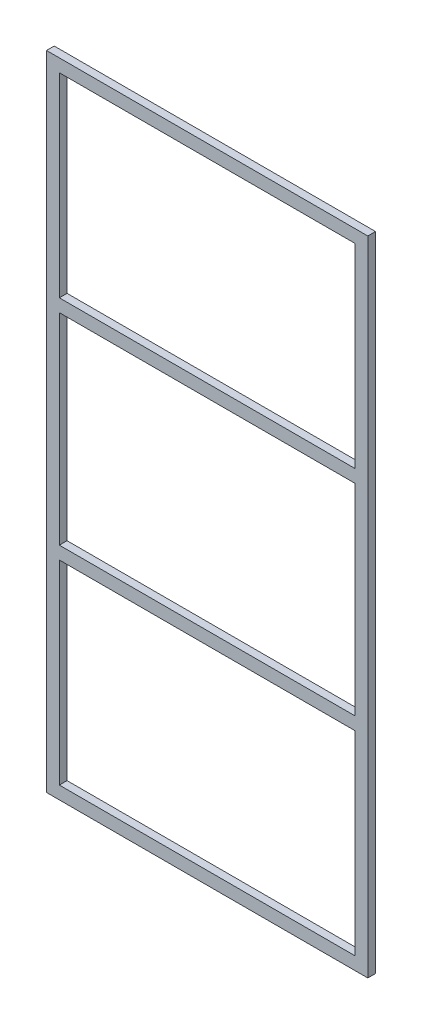
ISO-10303-21;
HEADER;
FILE_DESCRIPTION(('STEP AP214'),'2;1');
FILE_NAME('part.step','',(''),(''),'','','');
FILE_SCHEMA(('AUTOMOTIVE_DESIGN { 1 0 10303 214 1 1 1 1 }'));
ENDSEC;
DATA;
#1=APPLICATION_CONTEXT('core data for automotive mechanical design processes');
#2=APPLICATION_PROTOCOL_DEFINITION('international standard','automotive_design',2000,#1);
#3=PRODUCT_CONTEXT('',#1,'mechanical');
#4=PRODUCT('Part','Part','',(#3));
#5=PRODUCT_RELATED_PRODUCT_CATEGORY('part','',(#4));
#6=PRODUCT_DEFINITION_FORMATION('','',#4);
#7=PRODUCT_DEFINITION_CONTEXT('part definition',#1,'design');
#8=PRODUCT_DEFINITION('design','',#6,#7);
#9=PRODUCT_DEFINITION_SHAPE('','',#8);
#10=(LENGTH_UNIT() NAMED_UNIT(*) SI_UNIT(.MILLI.,.METRE.));
#11=(NAMED_UNIT(*) PLANE_ANGLE_UNIT() SI_UNIT($,.RADIAN.));
#12=(NAMED_UNIT(*) SI_UNIT($,.STERADIAN.) SOLID_ANGLE_UNIT());
#13=UNCERTAINTY_MEASURE_WITH_UNIT(LENGTH_MEASURE(1.E-05),#10,'distance_accuracy_value','');
#14=(GEOMETRIC_REPRESENTATION_CONTEXT(3) GLOBAL_UNCERTAINTY_ASSIGNED_CONTEXT((#13)) GLOBAL_UNIT_ASSIGNED_CONTEXT((#10,
#11,#12)) REPRESENTATION_CONTEXT('',''));
#15=CARTESIAN_POINT('',(0.,0.,0.));
#16=DIRECTION('',(0.,0.,1.));
#17=DIRECTION('',(1.,0.,0.));
#18=AXIS2_PLACEMENT_3D('',#15,#16,#17);
#19=CARTESIAN_POINT('',(0.,0.,6.));
#20=DIRECTION('',(0.,0.,1.));
#21=DIRECTION('',(1.,0.,0.));
#22=AXIS2_PLACEMENT_3D('',#19,#20,#21);
#23=PLANE('',#22);
#24=DIRECTION('',(0.,-1.,0.));
#25=VECTOR('',#24,1.);
#26=CARTESIAN_POINT('',(0.,0.,6.));
#27=LINE('',#26,#25);
#28=CARTESIAN_POINT('',(0.,0.,6.));
#29=VERTEX_POINT('',#28);
#30=CARTESIAN_POINT('',(0.,-500.,6.));
#31=VERTEX_POINT('',#30);
#32=EDGE_CURVE('E257',#29,#31,#27,.T.);
#33=ORIENTED_EDGE('',*,*,#32,.T.);
#34=DIRECTION('',(1.,0.,0.));
#35=VECTOR('',#34,1.);
#36=CARTESIAN_POINT('',(0.,-500.,6.));
#37=LINE('',#36,#35);
#38=CARTESIAN_POINT('',(250.,-500.,6.));
#39=VERTEX_POINT('',#38);
#40=EDGE_CURVE('E261',#31,#39,#37,.T.);
#41=ORIENTED_EDGE('',*,*,#40,.T.);
#42=DIRECTION('',(0.,1.,0.));
#43=VECTOR('',#42,1.);
#44=CARTESIAN_POINT('',(250.,0.,6.));
#45=LINE('',#44,#43);
#46=CARTESIAN_POINT('',(250.,0.,6.));
#47=VERTEX_POINT('',#46);
#48=EDGE_CURVE('E265',#39,#47,#45,.T.);
#49=ORIENTED_EDGE('',*,*,#48,.T.);
#50=DIRECTION('',(-1.,0.,0.));
#51=VECTOR('',#50,1.);
#52=CARTESIAN_POINT('',(0.,0.,6.));
#53=LINE('',#52,#51);
#54=EDGE_CURVE('E268',#47,#29,#53,.T.);
#55=ORIENTED_EDGE('',*,*,#54,.T.);
#56=EDGE_LOOP('',(#33,#41,#49,#55));
#57=FACE_BOUND('',#56,.T.);
#58=DIRECTION('',(1.,0.,0.));
#59=VECTOR('',#58,1.);
#60=CARTESIAN_POINT('',(0.,-171.666666,6.));
#61=LINE('',#60,#59);
#62=CARTESIAN_POINT('',(10.,-171.666666,6.));
#63=VERTEX_POINT('',#62);
#64=CARTESIAN_POINT('',(240.,-171.666666,6.));
#65=VERTEX_POINT('',#64);
#66=EDGE_CURVE('E231',#63,#65,#61,.T.);
#67=ORIENTED_EDGE('',*,*,#66,.T.);
#68=DIRECTION('',(0.,-1.,0.));
#69=VECTOR('',#68,1.);
#70=CARTESIAN_POINT('',(240.,0.,6.));
#71=LINE('',#70,#69);
#72=CARTESIAN_POINT('',(240.,-328.336666,6.));
#73=VERTEX_POINT('',#72);
#74=EDGE_CURVE('E197',#65,#73,#71,.T.);
#75=ORIENTED_EDGE('',*,*,#74,.T.);
#76=DIRECTION('',(1.,0.,0.));
#77=VECTOR('',#76,1.);
#78=CARTESIAN_POINT('',(0.,-328.336666,6.));
#79=LINE('',#78,#77);
#80=CARTESIAN_POINT('',(10.,-328.336666,6.));
#81=VERTEX_POINT('',#80);
#82=EDGE_CURVE('E239',#81,#73,#79,.T.);
#83=ORIENTED_EDGE('',*,*,#82,.F.);
#84=DIRECTION('',(0.,-1.,0.));
#85=VECTOR('',#84,1.);
#86=CARTESIAN_POINT('',(10.,0.,6.));
#87=LINE('',#86,#85);
#88=EDGE_CURVE('E235',#63,#81,#87,.T.);
#89=ORIENTED_EDGE('',*,*,#88,.F.);
#90=EDGE_LOOP('',(#67,#75,#83,#89));
#91=FACE_BOUND('',#90,.T.);
#92=DIRECTION('',(1.,0.,0.));
#93=VECTOR('',#92,1.);
#94=CARTESIAN_POINT('',(0.,-10.,6.));
#95=LINE('',#94,#93);
#96=CARTESIAN_POINT('',(10.,-10.,6.));
#97=VERTEX_POINT('',#96);
#98=CARTESIAN_POINT('',(240.,-10.,6.));
#99=VERTEX_POINT('',#98);
#100=EDGE_CURVE('E180',#97,#99,#95,.T.);
#101=ORIENTED_EDGE('',*,*,#100,.T.);
#102=DIRECTION('',(0.,-1.,0.));
#103=VECTOR('',#102,1.);
#104=CARTESIAN_POINT('',(240.,0.,6.));
#105=LINE('',#104,#103);
#106=CARTESIAN_POINT('',(240.,-161.666666,6.));
#107=VERTEX_POINT('',#106);
#108=EDGE_CURVE('E73',#99,#107,#105,.T.);
#109=ORIENTED_EDGE('',*,*,#108,.T.);
#110=DIRECTION('',(1.,0.,0.));
#111=VECTOR('',#110,1.);
#112=CARTESIAN_POINT('',(0.,-161.666666,6.));
#113=LINE('',#112,#111);
#114=CARTESIAN_POINT('',(10.,-161.666666,6.));
#115=VERTEX_POINT('',#114);
#116=EDGE_CURVE('E187',#115,#107,#113,.T.);
#117=ORIENTED_EDGE('',*,*,#116,.F.);
#118=DIRECTION('',(0.,-1.,0.));
#119=VECTOR('',#118,1.);
#120=CARTESIAN_POINT('',(10.,0.,6.));
#121=LINE('',#120,#119);
#122=EDGE_CURVE('E169',#97,#115,#121,.T.);
#123=ORIENTED_EDGE('',*,*,#122,.F.);
#124=EDGE_LOOP('',(#101,#109,#117,#123));
#125=FACE_BOUND('',#124,.T.);
#126=DIRECTION('',(1.,0.,0.));
#127=VECTOR('',#126,1.);
#128=CARTESIAN_POINT('',(0.,-338.336666,6.));
#129=LINE('',#128,#127);
#130=CARTESIAN_POINT('',(10.,-338.336666,6.));
#131=VERTEX_POINT('',#130);
#132=CARTESIAN_POINT('',(240.,-338.336666,6.));
#133=VERTEX_POINT('',#132);
#134=EDGE_CURVE('E204',#131,#133,#129,.T.);
#135=ORIENTED_EDGE('',*,*,#134,.T.);
#136=DIRECTION('',(0.,-1.,0.));
#137=VECTOR('',#136,1.);
#138=CARTESIAN_POINT('',(240.,0.,6.));
#139=LINE('',#138,#137);
#140=CARTESIAN_POINT('',(240.,-490.,6.));
#141=VERTEX_POINT('',#140);
#142=EDGE_CURVE('E65',#133,#141,#139,.T.);
#143=ORIENTED_EDGE('',*,*,#142,.T.);
#144=DIRECTION('',(1.,0.,0.));
#145=VECTOR('',#144,1.);
#146=CARTESIAN_POINT('',(0.,-490.,6.));
#147=LINE('',#146,#145);
#148=CARTESIAN_POINT('',(10.,-490.,6.));
#149=VERTEX_POINT('',#148);
#150=EDGE_CURVE('E212',#149,#141,#147,.T.);
#151=ORIENTED_EDGE('',*,*,#150,.F.);
#152=DIRECTION('',(0.,-1.,0.));
#153=VECTOR('',#152,1.);
#154=CARTESIAN_POINT('',(9.99999999999998,0.,6.));
#155=LINE('',#154,#153);
#156=EDGE_CURVE('E208',#131,#149,#155,.T.);
#157=ORIENTED_EDGE('',*,*,#156,.F.);
#158=EDGE_LOOP('',(#135,#143,#151,#157));
#159=FACE_BOUND('',#158,.T.);
#160=ADVANCED_FACE('F49',(#57,#91,#125,#159),#23,.T.);
#161=CARTESIAN_POINT('',(0.,0.,0.));
#162=DIRECTION('',(0.,0.,1.));
#163=DIRECTION('',(1.,0.,0.));
#164=AXIS2_PLACEMENT_3D('',#161,#162,#163);
#165=PLANE('',#164);
#166=DIRECTION('',(0.,-1.,0.));
#167=VECTOR('',#166,1.);
#168=CARTESIAN_POINT('',(240.,0.,0.));
#169=LINE('',#168,#167);
#170=CARTESIAN_POINT('',(240.,-10.,0.));
#171=VERTEX_POINT('',#170);
#172=CARTESIAN_POINT('',(240.,-161.666666,0.));
#173=VERTEX_POINT('',#172);
#174=EDGE_CURVE('E321',#171,#173,#169,.T.);
#175=ORIENTED_EDGE('',*,*,#174,.F.);
#176=DIRECTION('',(1.,0.,0.));
#177=VECTOR('',#176,1.);
#178=CARTESIAN_POINT('',(0.,-10.,0.));
#179=LINE('',#178,#177);
#180=CARTESIAN_POINT('',(10.,-10.,0.));
#181=VERTEX_POINT('',#180);
#182=EDGE_CURVE('E312',#181,#171,#179,.T.);
#183=ORIENTED_EDGE('',*,*,#182,.F.);
#184=DIRECTION('',(0.,-1.,0.));
#185=VECTOR('',#184,1.);
#186=CARTESIAN_POINT('',(10.,0.,0.));
#187=LINE('',#186,#185);
#188=CARTESIAN_POINT('',(10.,-161.666666,0.));
#189=VERTEX_POINT('',#188);
#190=EDGE_CURVE('E172',#181,#189,#187,.T.);
#191=ORIENTED_EDGE('',*,*,#190,.T.);
#192=DIRECTION('',(1.,0.,0.));
#193=VECTOR('',#192,1.);
#194=CARTESIAN_POINT('',(0.,-161.666666,0.));
#195=LINE('',#194,#193);
#196=EDGE_CURVE('E317',#189,#173,#195,.T.);
#197=ORIENTED_EDGE('',*,*,#196,.T.);
#198=EDGE_LOOP('',(#175,#183,#191,#197));
#199=FACE_BOUND('',#198,.T.);
#200=DIRECTION('',(0.,-1.,0.));
#201=VECTOR('',#200,1.);
#202=CARTESIAN_POINT('',(0.,0.,0.));
#203=LINE('',#202,#201);
#204=CARTESIAN_POINT('',(0.,0.,0.));
#205=VERTEX_POINT('',#204);
#206=CARTESIAN_POINT('',(0.,-500.,0.));
#207=VERTEX_POINT('',#206);
#208=EDGE_CURVE('E247',#205,#207,#203,.T.);
#209=ORIENTED_EDGE('',*,*,#208,.F.);
#210=DIRECTION('',(-1.,0.,0.));
#211=VECTOR('',#210,1.);
#212=CARTESIAN_POINT('',(0.,0.,0.));
#213=LINE('',#212,#211);
#214=CARTESIAN_POINT('',(250.,0.,0.));
#215=VERTEX_POINT('',#214);
#216=EDGE_CURVE('E262',#215,#205,#213,.T.);
#217=ORIENTED_EDGE('',*,*,#216,.F.);
#218=DIRECTION('',(0.,1.,0.));
#219=VECTOR('',#218,1.);
#220=CARTESIAN_POINT('',(250.,0.,0.));
#221=LINE('',#220,#219);
#222=CARTESIAN_POINT('',(250.,-500.,0.));
#223=VERTEX_POINT('',#222);
#224=EDGE_CURVE('E278',#223,#215,#221,.T.);
#225=ORIENTED_EDGE('',*,*,#224,.F.);
#226=DIRECTION('',(1.,0.,0.));
#227=VECTOR('',#226,1.);
#228=CARTESIAN_POINT('',(0.,-500.,0.));
#229=LINE('',#228,#227);
#230=EDGE_CURVE('E275',#207,#223,#229,.T.);
#231=ORIENTED_EDGE('',*,*,#230,.F.);
#232=EDGE_LOOP('',(#209,#217,#225,#231));
#233=FACE_BOUND('',#232,.T.);
#234=DIRECTION('',(0.,-1.,0.));
#235=VECTOR('',#234,1.);
#236=CARTESIAN_POINT('',(240.,0.,0.));
#237=LINE('',#236,#235);
#238=CARTESIAN_POINT('',(240.,-171.666666,0.));
#239=VERTEX_POINT('',#238);
#240=CARTESIAN_POINT('',(240.,-328.336666,0.));
#241=VERTEX_POINT('',#240);
#242=EDGE_CURVE('E309',#239,#241,#237,.T.);
#243=ORIENTED_EDGE('',*,*,#242,.F.);
#244=DIRECTION('',(1.,0.,0.));
#245=VECTOR('',#244,1.);
#246=CARTESIAN_POINT('',(0.,-171.666666,0.));
#247=LINE('',#246,#245);
#248=CARTESIAN_POINT('',(10.,-171.666666,0.));
#249=VERTEX_POINT('',#248);
#250=EDGE_CURVE('E298',#249,#239,#247,.T.);
#251=ORIENTED_EDGE('',*,*,#250,.F.);
#252=DIRECTION('',(0.,-1.,0.));
#253=VECTOR('',#252,1.);
#254=CARTESIAN_POINT('',(10.,0.,0.));
#255=LINE('',#254,#253);
#256=CARTESIAN_POINT('',(10.,-328.336666,0.));
#257=VERTEX_POINT('',#256);
#258=EDGE_CURVE('E301',#249,#257,#255,.T.);
#259=ORIENTED_EDGE('',*,*,#258,.T.);
#260=DIRECTION('',(1.,0.,0.));
#261=VECTOR('',#260,1.);
#262=CARTESIAN_POINT('',(0.,-328.336666,0.));
#263=LINE('',#262,#261);
#264=EDGE_CURVE('E305',#257,#241,#263,.T.);
#265=ORIENTED_EDGE('',*,*,#264,.T.);
#266=EDGE_LOOP('',(#243,#251,#259,#265));
#267=FACE_BOUND('',#266,.T.);
#268=DIRECTION('',(0.,-1.,0.));
#269=VECTOR('',#268,1.);
#270=CARTESIAN_POINT('',(240.,0.,0.));
#271=LINE('',#270,#269);
#272=CARTESIAN_POINT('',(240.,-338.336666,0.));
#273=VERTEX_POINT('',#272);
#274=CARTESIAN_POINT('',(240.,-490.,0.));
#275=VERTEX_POINT('',#274);
#276=EDGE_CURVE('E11',#273,#275,#271,.T.);
#277=ORIENTED_EDGE('',*,*,#276,.F.);
#278=DIRECTION('',(1.,0.,0.));
#279=VECTOR('',#278,1.);
#280=CARTESIAN_POINT('',(0.,-338.336666,0.));
#281=LINE('',#280,#279);
#282=CARTESIAN_POINT('',(10.,-338.336666,0.));
#283=VERTEX_POINT('',#282);
#284=EDGE_CURVE('E324',#283,#273,#281,.T.);
#285=ORIENTED_EDGE('',*,*,#284,.F.);
#286=DIRECTION('',(0.,-1.,0.));
#287=VECTOR('',#286,1.);
#288=CARTESIAN_POINT('',(9.99999999999998,0.,0.));
#289=LINE('',#288,#287);
#290=CARTESIAN_POINT('',(10.,-490.,0.));
#291=VERTEX_POINT('',#290);
#292=EDGE_CURVE('E327',#283,#291,#289,.T.);
#293=ORIENTED_EDGE('',*,*,#292,.T.);
#294=DIRECTION('',(1.,0.,0.));
#295=VECTOR('',#294,1.);
#296=CARTESIAN_POINT('',(0.,-490.,0.));
#297=LINE('',#296,#295);
#298=EDGE_CURVE('E58',#291,#275,#297,.T.);
#299=ORIENTED_EDGE('',*,*,#298,.T.);
#300=EDGE_LOOP('',(#277,#285,#293,#299));
#301=FACE_BOUND('',#300,.T.);
#302=ADVANCED_FACE('F334',(#199,#233,#267,#301),#165,.F.);
#303=CARTESIAN_POINT('',(0.,0.,6.));
#304=DIRECTION('',(1.,0.,0.));
#305=DIRECTION('',(0.,1.,0.));
#306=AXIS2_PLACEMENT_3D('',#303,#304,#305);
#307=PLANE('',#306);
#308=ORIENTED_EDGE('',*,*,#208,.T.);
#309=DIRECTION('',(0.,0.,-1.));
#310=VECTOR('',#309,1.);
#311=CARTESIAN_POINT('',(0.,-500.,6.));
#312=LINE('',#311,#310);
#313=EDGE_CURVE('E294',#31,#207,#312,.T.);
#314=ORIENTED_EDGE('',*,*,#313,.F.);
#315=ORIENTED_EDGE('',*,*,#32,.F.);
#316=DIRECTION('',(0.,0.,-1.));
#317=VECTOR('',#316,1.);
#318=CARTESIAN_POINT('',(0.,0.,6.));
#319=LINE('',#318,#317);
#320=EDGE_CURVE('E271',#29,#205,#319,.T.);
#321=ORIENTED_EDGE('',*,*,#320,.T.);
#322=EDGE_LOOP('',(#308,#314,#315,#321));
#323=FACE_BOUND('',#322,.T.);
#324=ADVANCED_FACE('F51',(#323),#307,.F.);
#325=CARTESIAN_POINT('',(0.,-500.,6.));
#326=DIRECTION('',(0.,1.,0.));
#327=DIRECTION('',(0.,0.,1.));
#328=AXIS2_PLACEMENT_3D('',#325,#326,#327);
#329=PLANE('',#328);
#330=ORIENTED_EDGE('',*,*,#230,.T.);
#331=DIRECTION('',(0.,0.,-1.));
#332=VECTOR('',#331,1.);
#333=CARTESIAN_POINT('',(250.,-500.,6.));
#334=LINE('',#333,#332);
#335=EDGE_CURVE('E290',#39,#223,#334,.T.);
#336=ORIENTED_EDGE('',*,*,#335,.F.);
#337=ORIENTED_EDGE('',*,*,#40,.F.);
#338=ORIENTED_EDGE('',*,*,#313,.T.);
#339=EDGE_LOOP('',(#330,#336,#337,#338));
#340=FACE_BOUND('',#339,.T.);
#341=ADVANCED_FACE('F378',(#340),#329,.F.);
#342=CARTESIAN_POINT('',(250.,0.,6.));
#343=DIRECTION('',(-1.,0.,0.));
#344=DIRECTION('',(0.,-1.,0.));
#345=AXIS2_PLACEMENT_3D('',#342,#343,#344);
#346=PLANE('',#345);
#347=ORIENTED_EDGE('',*,*,#224,.T.);
#348=DIRECTION('',(0.,0.,-1.));
#349=VECTOR('',#348,1.);
#350=CARTESIAN_POINT('',(250.,0.,6.));
#351=LINE('',#350,#349);
#352=EDGE_CURVE('E286',#47,#215,#351,.T.);
#353=ORIENTED_EDGE('',*,*,#352,.F.);
#354=ORIENTED_EDGE('',*,*,#48,.F.);
#355=ORIENTED_EDGE('',*,*,#335,.T.);
#356=EDGE_LOOP('',(#347,#353,#354,#355));
#357=FACE_BOUND('',#356,.T.);
#358=ADVANCED_FACE('F375',(#357),#346,.F.);
#359=CARTESIAN_POINT('',(0.,0.,6.));
#360=DIRECTION('',(0.,-1.,0.));
#361=DIRECTION('',(0.,0.,-1.));
#362=AXIS2_PLACEMENT_3D('',#359,#360,#361);
#363=PLANE('',#362);
#364=ORIENTED_EDGE('',*,*,#216,.T.);
#365=ORIENTED_EDGE('',*,*,#320,.F.);
#366=ORIENTED_EDGE('',*,*,#54,.F.);
#367=ORIENTED_EDGE('',*,*,#352,.T.);
#368=EDGE_LOOP('',(#364,#365,#366,#367));
#369=FACE_BOUND('',#368,.T.);
#370=ADVANCED_FACE('F373',(#369),#363,.F.);
#371=CARTESIAN_POINT('',(240.,0.,-4.));
#372=DIRECTION('',(-1.,0.,0.));
#373=DIRECTION('',(0.,0.,1.));
#374=AXIS2_PLACEMENT_3D('',#371,#372,#373);
#375=PLANE('',#374);
#376=ORIENTED_EDGE('',*,*,#242,.T.);
#377=DIRECTION('',(0.,0.,1.));
#378=VECTOR('',#377,1.);
#379=CARTESIAN_POINT('',(240.,-328.336666,-4.));
#380=LINE('',#379,#378);
#381=EDGE_CURVE('E244',#241,#73,#380,.T.);
#382=ORIENTED_EDGE('',*,*,#381,.T.);
#383=ORIENTED_EDGE('',*,*,#74,.F.);
#384=DIRECTION('',(0.,0.,1.));
#385=VECTOR('',#384,1.);
#386=CARTESIAN_POINT('',(240.,-171.666666,-4.));
#387=LINE('',#386,#385);
#388=EDGE_CURVE('E243',#239,#65,#387,.T.);
#389=ORIENTED_EDGE('',*,*,#388,.F.);
#390=EDGE_LOOP('',(#376,#382,#383,#389));
#391=FACE_BOUND('',#390,.T.);
#392=ADVANCED_FACE('F370',(#391),#375,.T.);
#393=CARTESIAN_POINT('',(0.,-328.336666,-4.));
#394=DIRECTION('',(0.,-1.,0.));
#395=DIRECTION('',(0.,0.,-1.));
#396=AXIS2_PLACEMENT_3D('',#393,#394,#395);
#397=PLANE('',#396);
#398=DIRECTION('',(0.,0.,1.));
#399=VECTOR('',#398,1.);
#400=CARTESIAN_POINT('',(10.,-328.336666,-4.));
#401=LINE('',#400,#399);
#402=EDGE_CURVE('E248',#257,#81,#401,.T.);
#403=ORIENTED_EDGE('',*,*,#402,.T.);
#404=ORIENTED_EDGE('',*,*,#82,.T.);
#405=ORIENTED_EDGE('',*,*,#381,.F.);
#406=ORIENTED_EDGE('',*,*,#264,.F.);
#407=EDGE_LOOP('',(#403,#404,#405,#406));
#408=FACE_BOUND('',#407,.T.);
#409=ADVANCED_FACE('F404',(#408),#397,.F.);
#410=CARTESIAN_POINT('',(10.,0.,-4.));
#411=DIRECTION('',(-1.,0.,0.));
#412=DIRECTION('',(0.,-1.,0.));
#413=AXIS2_PLACEMENT_3D('',#410,#411,#412);
#414=PLANE('',#413);
#415=DIRECTION('',(0.,0.,1.));
#416=VECTOR('',#415,1.);
#417=CARTESIAN_POINT('',(10.,-171.666666,-4.));
#418=LINE('',#417,#416);
#419=EDGE_CURVE('E251',#249,#63,#418,.T.);
#420=ORIENTED_EDGE('',*,*,#419,.T.);
#421=ORIENTED_EDGE('',*,*,#88,.T.);
#422=ORIENTED_EDGE('',*,*,#402,.F.);
#423=ORIENTED_EDGE('',*,*,#258,.F.);
#424=EDGE_LOOP('',(#420,#421,#422,#423));
#425=FACE_BOUND('',#424,.T.);
#426=ADVANCED_FACE('F413',(#425),#414,.F.);
#427=CARTESIAN_POINT('',(0.,-171.666666,-4.));
#428=DIRECTION('',(0.,-1.,0.));
#429=DIRECTION('',(0.,0.,-1.));
#430=AXIS2_PLACEMENT_3D('',#427,#428,#429);
#431=PLANE('',#430);
#432=ORIENTED_EDGE('',*,*,#250,.T.);
#433=ORIENTED_EDGE('',*,*,#388,.T.);
#434=ORIENTED_EDGE('',*,*,#66,.F.);
#435=ORIENTED_EDGE('',*,*,#419,.F.);
#436=EDGE_LOOP('',(#432,#433,#434,#435));
#437=FACE_BOUND('',#436,.T.);
#438=ADVANCED_FACE('F410',(#437),#431,.T.);
#439=CARTESIAN_POINT('',(240.,0.,-4.));
#440=DIRECTION('',(-1.,0.,0.));
#441=DIRECTION('',(0.,-1.,0.));
#442=AXIS2_PLACEMENT_3D('',#439,#440,#441);
#443=PLANE('',#442);
#444=ORIENTED_EDGE('',*,*,#174,.T.);
#445=DIRECTION('',(0.,0.,1.));
#446=VECTOR('',#445,1.);
#447=CARTESIAN_POINT('',(240.,-161.666666,-4.));
#448=LINE('',#447,#446);
#449=EDGE_CURVE('E194',#173,#107,#448,.T.);
#450=ORIENTED_EDGE('',*,*,#449,.T.);
#451=ORIENTED_EDGE('',*,*,#108,.F.);
#452=DIRECTION('',(0.,0.,1.));
#453=VECTOR('',#452,1.);
#454=CARTESIAN_POINT('',(240.,-10.,-4.));
#455=LINE('',#454,#453);
#456=EDGE_CURVE('E177',#171,#99,#455,.T.);
#457=ORIENTED_EDGE('',*,*,#456,.F.);
#458=EDGE_LOOP('',(#444,#450,#451,#457));
#459=FACE_BOUND('',#458,.T.);
#460=ADVANCED_FACE('F420',(#459),#443,.T.);
#461=CARTESIAN_POINT('',(0.,-161.666666,-4.));
#462=DIRECTION('',(0.,-1.,0.));
#463=DIRECTION('',(0.,0.,-1.));
#464=AXIS2_PLACEMENT_3D('',#461,#462,#463);
#465=PLANE('',#464);
#466=DIRECTION('',(0.,0.,1.));
#467=VECTOR('',#466,1.);
#468=CARTESIAN_POINT('',(10.,-161.666666,-4.));
#469=LINE('',#468,#467);
#470=EDGE_CURVE('E176',#189,#115,#469,.T.);
#471=ORIENTED_EDGE('',*,*,#470,.T.);
#472=ORIENTED_EDGE('',*,*,#116,.T.);
#473=ORIENTED_EDGE('',*,*,#449,.F.);
#474=ORIENTED_EDGE('',*,*,#196,.F.);
#475=EDGE_LOOP('',(#471,#472,#473,#474));
#476=FACE_BOUND('',#475,.T.);
#477=ADVANCED_FACE('F462',(#476),#465,.F.);
#478=CARTESIAN_POINT('',(10.,0.,-4.));
#479=DIRECTION('',(-1.,0.,0.));
#480=DIRECTION('',(0.,-1.,0.));
#481=AXIS2_PLACEMENT_3D('',#478,#479,#480);
#482=PLANE('',#481);
#483=DIRECTION('',(0.,0.,1.));
#484=VECTOR('',#483,1.);
#485=CARTESIAN_POINT('',(10.,-10.,-4.));
#486=LINE('',#485,#484);
#487=EDGE_CURVE('E164',#181,#97,#486,.T.);
#488=ORIENTED_EDGE('',*,*,#487,.T.);
#489=ORIENTED_EDGE('',*,*,#122,.T.);
#490=ORIENTED_EDGE('',*,*,#470,.F.);
#491=ORIENTED_EDGE('',*,*,#190,.F.);
#492=EDGE_LOOP('',(#488,#489,#490,#491));
#493=FACE_BOUND('',#492,.T.);
#494=ADVANCED_FACE('F166',(#493),#482,.F.);
#495=CARTESIAN_POINT('',(0.,-10.,-4.));
#496=DIRECTION('',(0.,-1.,0.));
#497=DIRECTION('',(0.,0.,-1.));
#498=AXIS2_PLACEMENT_3D('',#495,#496,#497);
#499=PLANE('',#498);
#500=ORIENTED_EDGE('',*,*,#182,.T.);
#501=ORIENTED_EDGE('',*,*,#456,.T.);
#502=ORIENTED_EDGE('',*,*,#100,.F.);
#503=ORIENTED_EDGE('',*,*,#487,.F.);
#504=EDGE_LOOP('',(#500,#501,#502,#503));
#505=FACE_BOUND('',#504,.T.);
#506=ADVANCED_FACE('F181',(#505),#499,.T.);
#507=CARTESIAN_POINT('',(240.,0.,-4.));
#508=DIRECTION('',(-1.,0.,0.));
#509=DIRECTION('',(0.,-1.,0.));
#510=AXIS2_PLACEMENT_3D('',#507,#508,#509);
#511=PLANE('',#510);
#512=ORIENTED_EDGE('',*,*,#276,.T.);
#513=DIRECTION('',(0.,0.,1.));
#514=VECTOR('',#513,1.);
#515=CARTESIAN_POINT('',(240.,-490.,-4.));
#516=LINE('',#515,#514);
#517=EDGE_CURVE('E217',#275,#141,#516,.T.);
#518=ORIENTED_EDGE('',*,*,#517,.T.);
#519=ORIENTED_EDGE('',*,*,#142,.F.);
#520=DIRECTION('',(0.,0.,1.));
#521=VECTOR('',#520,1.);
#522=CARTESIAN_POINT('',(240.,-338.336666,-4.));
#523=LINE('',#522,#521);
#524=EDGE_CURVE('E216',#273,#133,#523,.T.);
#525=ORIENTED_EDGE('',*,*,#524,.F.);
#526=EDGE_LOOP('',(#512,#518,#519,#525));
#527=FACE_BOUND('',#526,.T.);
#528=ADVANCED_FACE('F348',(#527),#511,.T.);
#529=CARTESIAN_POINT('',(0.,-490.,-4.));
#530=DIRECTION('',(0.,-1.,0.));
#531=DIRECTION('',(0.,0.,-1.));
#532=AXIS2_PLACEMENT_3D('',#529,#530,#531);
#533=PLANE('',#532);
#534=DIRECTION('',(0.,0.,1.));
#535=VECTOR('',#534,1.);
#536=CARTESIAN_POINT('',(10.,-490.,-4.));
#537=LINE('',#536,#535);
#538=EDGE_CURVE('E220',#291,#149,#537,.T.);
#539=ORIENTED_EDGE('',*,*,#538,.T.);
#540=ORIENTED_EDGE('',*,*,#150,.T.);
#541=ORIENTED_EDGE('',*,*,#517,.F.);
#542=ORIENTED_EDGE('',*,*,#298,.F.);
#543=EDGE_LOOP('',(#539,#540,#541,#542));
#544=FACE_BOUND('',#543,.T.);
#545=ADVANCED_FACE('F340',(#544),#533,.F.);
#546=CARTESIAN_POINT('',(9.99999999999998,0.,-4.));
#547=DIRECTION('',(-1.,0.,0.));
#548=DIRECTION('',(0.,-1.,0.));
#549=AXIS2_PLACEMENT_3D('',#546,#547,#548);
#550=PLANE('',#549);
#551=DIRECTION('',(0.,0.,1.));
#552=VECTOR('',#551,1.);
#553=CARTESIAN_POINT('',(10.,-338.336666,-4.));
#554=LINE('',#553,#552);
#555=EDGE_CURVE('E223',#283,#131,#554,.T.);
#556=ORIENTED_EDGE('',*,*,#555,.T.);
#557=ORIENTED_EDGE('',*,*,#156,.T.);
#558=ORIENTED_EDGE('',*,*,#538,.F.);
#559=ORIENTED_EDGE('',*,*,#292,.F.);
#560=EDGE_LOOP('',(#556,#557,#558,#559));
#561=FACE_BOUND('',#560,.T.);
#562=ADVANCED_FACE('F342',(#561),#550,.F.);
#563=CARTESIAN_POINT('',(0.,-338.336666,-4.));
#564=DIRECTION('',(0.,-1.,0.));
#565=DIRECTION('',(0.,0.,-1.));
#566=AXIS2_PLACEMENT_3D('',#563,#564,#565);
#567=PLANE('',#566);
#568=ORIENTED_EDGE('',*,*,#284,.T.);
#569=ORIENTED_EDGE('',*,*,#524,.T.);
#570=ORIENTED_EDGE('',*,*,#134,.F.);
#571=ORIENTED_EDGE('',*,*,#555,.F.);
#572=EDGE_LOOP('',(#568,#569,#570,#571));
#573=FACE_BOUND('',#572,.T.);
#574=ADVANCED_FACE('F347',(#573),#567,.T.);
#575=CLOSED_SHELL('',(#160,#302,#324,#341,#358,#370,#392,#409,#426,#438,#460,#477,#494,#506,
#528,#545,#562,#574));
#576=MANIFOLD_SOLID_BREP('B2',#575);
#577=ADVANCED_BREP_SHAPE_REPRESENTATION('',(#18,#576),#14);
#578=SHAPE_DEFINITION_REPRESENTATION(#9,#577);
ENDSEC;
END-ISO-10303-21;
